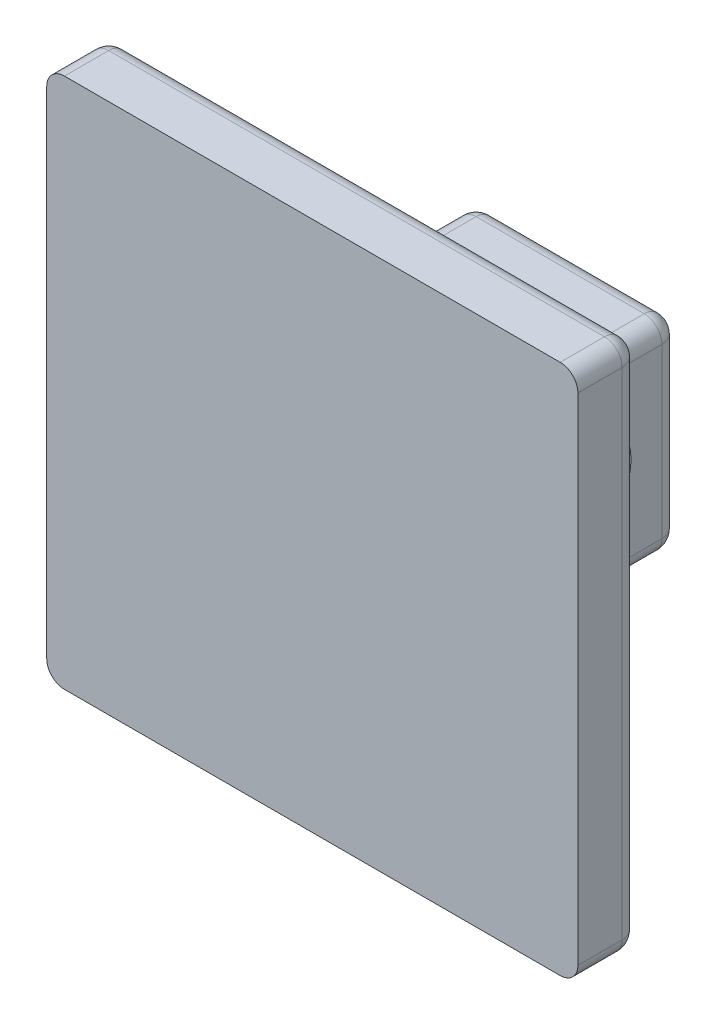
ISO-10303-21;
HEADER;
FILE_DESCRIPTION(('STEP AP214'),'2;1');
FILE_NAME('part.step','',(''),(''),'','','');
FILE_SCHEMA(('AUTOMOTIVE_DESIGN { 1 0 10303 214 1 1 1 1 }'));
ENDSEC;
DATA;
#1=APPLICATION_CONTEXT('core data for automotive mechanical design processes');
#2=APPLICATION_PROTOCOL_DEFINITION('international standard','automotive_design',2000,#1);
#3=PRODUCT_CONTEXT('',#1,'mechanical');
#4=PRODUCT('Part','Part','',(#3));
#5=PRODUCT_RELATED_PRODUCT_CATEGORY('part','',(#4));
#6=PRODUCT_DEFINITION_FORMATION('','',#4);
#7=PRODUCT_DEFINITION_CONTEXT('part definition',#1,'design');
#8=PRODUCT_DEFINITION('design','',#6,#7);
#9=PRODUCT_DEFINITION_SHAPE('','',#8);
#10=(LENGTH_UNIT() NAMED_UNIT(*) SI_UNIT(.MILLI.,.METRE.));
#11=(NAMED_UNIT(*) PLANE_ANGLE_UNIT() SI_UNIT($,.RADIAN.));
#12=(NAMED_UNIT(*) SI_UNIT($,.STERADIAN.) SOLID_ANGLE_UNIT());
#13=UNCERTAINTY_MEASURE_WITH_UNIT(LENGTH_MEASURE(1.E-05),#10,'distance_accuracy_value','');
#14=(GEOMETRIC_REPRESENTATION_CONTEXT(3) GLOBAL_UNCERTAINTY_ASSIGNED_CONTEXT((#13)) GLOBAL_UNIT_ASSIGNED_CONTEXT((#10,
#11,#12)) REPRESENTATION_CONTEXT('',''));
#15=CARTESIAN_POINT('',(0.,0.,0.));
#16=DIRECTION('',(0.,0.,1.));
#17=DIRECTION('',(1.,0.,0.));
#18=AXIS2_PLACEMENT_3D('',#15,#16,#17);
#19=CARTESIAN_POINT('',(-30.,-30.,30.));
#20=DIRECTION('',(1.,0.,0.));
#21=DIRECTION('',(0.,0.,-1.));
#22=AXIS2_PLACEMENT_3D('',#19,#20,#21);
#23=PLANE('',#22);
#24=DIRECTION('',(0.,-1.,0.));
#25=VECTOR('',#24,1.);
#26=CARTESIAN_POINT('',(-30.,-30.,30.));
#27=LINE('',#26,#25);
#28=CARTESIAN_POINT('',(-30.,28.,30.));
#29=VERTEX_POINT('',#28);
#30=CARTESIAN_POINT('',(-30.,-28.,30.));
#31=VERTEX_POINT('',#30);
#32=EDGE_CURVE('E195',#29,#31,#27,.T.);
#33=ORIENTED_EDGE('',*,*,#32,.F.);
#34=DIRECTION('',(0.,0.,-1.));
#35=VECTOR('',#34,1.);
#36=CARTESIAN_POINT('',(-30.,28.,30.));
#37=LINE('',#36,#35);
#38=CARTESIAN_POINT('',(-30.,28.,25.));
#39=VERTEX_POINT('',#38);
#40=EDGE_CURVE('E12',#29,#39,#37,.T.);
#41=ORIENTED_EDGE('',*,*,#40,.T.);
#42=DIRECTION('',(0.,-1.,0.));
#43=VECTOR('',#42,1.);
#44=CARTESIAN_POINT('',(-30.,-30.,25.));
#45=LINE('',#44,#43);
#46=CARTESIAN_POINT('',(-30.,-28.,25.));
#47=VERTEX_POINT('',#46);
#48=EDGE_CURVE('E137',#39,#47,#45,.T.);
#49=ORIENTED_EDGE('',*,*,#48,.T.);
#50=DIRECTION('',(0.,0.,-1.));
#51=VECTOR('',#50,1.);
#52=CARTESIAN_POINT('',(-30.,-28.,30.));
#53=LINE('',#52,#51);
#54=EDGE_CURVE('E60',#47,#31,#53,.F.);
#55=ORIENTED_EDGE('',*,*,#54,.T.);
#56=EDGE_LOOP('',(#33,#41,#49,#55));
#57=FACE_BOUND('',#56,.T.);
#58=ADVANCED_FACE('F51',(#57),#23,.F.);
#59=CARTESIAN_POINT('',(30.,-30.,30.));
#60=DIRECTION('',(0.,1.,0.));
#61=DIRECTION('',(-1.,0.,0.));
#62=AXIS2_PLACEMENT_3D('',#59,#60,#61);
#63=PLANE('',#62);
#64=DIRECTION('',(1.,0.,0.));
#65=VECTOR('',#64,1.);
#66=CARTESIAN_POINT('',(30.,-30.,25.));
#67=LINE('',#66,#65);
#68=CARTESIAN_POINT('',(-28.,-30.,25.));
#69=VERTEX_POINT('',#68);
#70=CARTESIAN_POINT('',(28.,-30.,25.));
#71=VERTEX_POINT('',#70);
#72=EDGE_CURVE('E228',#69,#71,#67,.T.);
#73=ORIENTED_EDGE('',*,*,#72,.T.);
#74=DIRECTION('',(0.,0.,-1.));
#75=VECTOR('',#74,1.);
#76=CARTESIAN_POINT('',(28.,-30.,30.));
#77=LINE('',#76,#75);
#78=CARTESIAN_POINT('',(28.,-30.,30.));
#79=VERTEX_POINT('',#78);
#80=EDGE_CURVE('E179',#71,#79,#77,.F.);
#81=ORIENTED_EDGE('',*,*,#80,.T.);
#82=DIRECTION('',(1.,0.,0.));
#83=VECTOR('',#82,1.);
#84=CARTESIAN_POINT('',(30.,-30.,30.));
#85=LINE('',#84,#83);
#86=CARTESIAN_POINT('',(-28.,-30.,30.));
#87=VERTEX_POINT('',#86);
#88=EDGE_CURVE('E215',#87,#79,#85,.T.);
#89=ORIENTED_EDGE('',*,*,#88,.F.);
#90=DIRECTION('',(0.,0.,-1.));
#91=VECTOR('',#90,1.);
#92=CARTESIAN_POINT('',(-28.,-30.,30.));
#93=LINE('',#92,#91);
#94=EDGE_CURVE('E177',#87,#69,#93,.T.);
#95=ORIENTED_EDGE('',*,*,#94,.T.);
#96=EDGE_LOOP('',(#73,#81,#89,#95));
#97=FACE_BOUND('',#96,.T.);
#98=ADVANCED_FACE('F244',(#97),#63,.F.);
#99=CARTESIAN_POINT('',(30.,-30.,30.));
#100=DIRECTION('',(-1.,0.,0.));
#101=DIRECTION('',(0.,0.,1.));
#102=AXIS2_PLACEMENT_3D('',#99,#100,#101);
#103=PLANE('',#102);
#104=DIRECTION('',(0.,1.,0.));
#105=VECTOR('',#104,1.);
#106=CARTESIAN_POINT('',(30.,-30.,30.));
#107=LINE('',#106,#105);
#108=CARTESIAN_POINT('',(30.,-28.,30.));
#109=VERTEX_POINT('',#108);
#110=CARTESIAN_POINT('',(30.,28.,30.));
#111=VERTEX_POINT('',#110);
#112=EDGE_CURVE('E217',#109,#111,#107,.T.);
#113=ORIENTED_EDGE('',*,*,#112,.F.);
#114=DIRECTION('',(0.,0.,-1.));
#115=VECTOR('',#114,1.);
#116=CARTESIAN_POINT('',(30.,-28.,30.));
#117=LINE('',#116,#115);
#118=CARTESIAN_POINT('',(30.,-28.,25.));
#119=VERTEX_POINT('',#118);
#120=EDGE_CURVE('E175',#109,#119,#117,.T.);
#121=ORIENTED_EDGE('',*,*,#120,.T.);
#122=DIRECTION('',(0.,1.,0.));
#123=VECTOR('',#122,1.);
#124=CARTESIAN_POINT('',(30.,-30.,25.));
#125=LINE('',#124,#123);
#126=CARTESIAN_POINT('',(30.,28.,25.));
#127=VERTEX_POINT('',#126);
#128=EDGE_CURVE('E162',#119,#127,#125,.T.);
#129=ORIENTED_EDGE('',*,*,#128,.T.);
#130=DIRECTION('',(0.,0.,-1.));
#131=VECTOR('',#130,1.);
#132=CARTESIAN_POINT('',(30.,28.,30.));
#133=LINE('',#132,#131);
#134=EDGE_CURVE('E141',#127,#111,#133,.F.);
#135=ORIENTED_EDGE('',*,*,#134,.T.);
#136=EDGE_LOOP('',(#113,#121,#129,#135));
#137=FACE_BOUND('',#136,.T.);
#138=ADVANCED_FACE('F259',(#137),#103,.F.);
#139=CARTESIAN_POINT('',(30.,30.,30.));
#140=DIRECTION('',(0.,-1.,0.));
#141=DIRECTION('',(1.,0.,0.));
#142=AXIS2_PLACEMENT_3D('',#139,#140,#141);
#143=PLANE('',#142);
#144=DIRECTION('',(-1.,0.,0.));
#145=VECTOR('',#144,1.);
#146=CARTESIAN_POINT('',(30.,30.,30.));
#147=LINE('',#146,#145);
#148=CARTESIAN_POINT('',(28.,30.,30.));
#149=VERTEX_POINT('',#148);
#150=CARTESIAN_POINT('',(-28.,30.,30.));
#151=VERTEX_POINT('',#150);
#152=EDGE_CURVE('E221',#149,#151,#147,.T.);
#153=ORIENTED_EDGE('',*,*,#152,.F.);
#154=DIRECTION('',(0.,0.,-1.));
#155=VECTOR('',#154,1.);
#156=CARTESIAN_POINT('',(28.,30.,30.));
#157=LINE('',#156,#155);
#158=CARTESIAN_POINT('',(28.,30.,25.));
#159=VERTEX_POINT('',#158);
#160=EDGE_CURVE('E189',#149,#159,#157,.T.);
#161=ORIENTED_EDGE('',*,*,#160,.T.);
#162=DIRECTION('',(-1.,0.,0.));
#163=VECTOR('',#162,1.);
#164=CARTESIAN_POINT('',(30.,30.,25.));
#165=LINE('',#164,#163);
#166=CARTESIAN_POINT('',(-28.,30.,25.));
#167=VERTEX_POINT('',#166);
#168=EDGE_CURVE('E232',#159,#167,#165,.T.);
#169=ORIENTED_EDGE('',*,*,#168,.T.);
#170=DIRECTION('',(0.,0.,-1.));
#171=VECTOR('',#170,1.);
#172=CARTESIAN_POINT('',(-28.,30.,30.));
#173=LINE('',#172,#171);
#174=EDGE_CURVE('E68',#167,#151,#173,.F.);
#175=ORIENTED_EDGE('',*,*,#174,.T.);
#176=EDGE_LOOP('',(#153,#161,#169,#175));
#177=FACE_BOUND('',#176,.T.);
#178=ADVANCED_FACE('F265',(#177),#143,.F.);
#179=CARTESIAN_POINT('',(0.,0.,30.));
#180=DIRECTION('',(0.,0.,1.));
#181=DIRECTION('',(1.,0.,0.));
#182=AXIS2_PLACEMENT_3D('',#179,#180,#181);
#183=PLANE('',#182);
#184=ORIENTED_EDGE('',*,*,#88,.T.);
#185=CARTESIAN_POINT('',(28.,-28.,30.));
#186=DIRECTION('',(0.,0.,1.));
#187=DIRECTION('',(1.,0.,0.));
#188=AXIS2_PLACEMENT_3D('',#185,#186,#187);
#189=CIRCLE('',#188,2.);
#190=EDGE_CURVE('E186',#79,#109,#189,.T.);
#191=ORIENTED_EDGE('',*,*,#190,.T.);
#192=ORIENTED_EDGE('',*,*,#112,.T.);
#193=CARTESIAN_POINT('',(28.,28.,30.));
#194=DIRECTION('',(0.,0.,1.));
#195=DIRECTION('',(1.,0.,0.));
#196=AXIS2_PLACEMENT_3D('',#193,#194,#195);
#197=CIRCLE('',#196,2.);
#198=EDGE_CURVE('E75',#111,#149,#197,.T.);
#199=ORIENTED_EDGE('',*,*,#198,.T.);
#200=ORIENTED_EDGE('',*,*,#152,.T.);
#201=CARTESIAN_POINT('',(-28.,28.,30.));
#202=DIRECTION('',(0.,0.,1.));
#203=DIRECTION('',(1.,0.,0.));
#204=AXIS2_PLACEMENT_3D('',#201,#202,#203);
#205=CIRCLE('',#204,2.);
#206=EDGE_CURVE('E183',#151,#29,#205,.T.);
#207=ORIENTED_EDGE('',*,*,#206,.T.);
#208=ORIENTED_EDGE('',*,*,#32,.T.);
#209=CARTESIAN_POINT('',(-28.,-28.,30.));
#210=DIRECTION('',(0.,0.,1.));
#211=DIRECTION('',(1.,0.,0.));
#212=AXIS2_PLACEMENT_3D('',#209,#210,#211);
#213=CIRCLE('',#212,2.);
#214=EDGE_CURVE('E181',#31,#87,#213,.T.);
#215=ORIENTED_EDGE('',*,*,#214,.T.);
#216=EDGE_LOOP('',(#184,#191,#192,#199,#200,#207,#208,#215));
#217=FACE_BOUND('',#216,.T.);
#218=ADVANCED_FACE('F212',(#217),#183,.T.);
#219=CARTESIAN_POINT('',(0.,0.,23.));
#220=DIRECTION('',(0.,0.,1.));
#221=DIRECTION('',(1.,0.,0.));
#222=AXIS2_PLACEMENT_3D('',#219,#220,#221);
#223=PLANE('',#222);
#224=DIRECTION('',(-1.,0.,0.));
#225=VECTOR('',#224,1.);
#226=CARTESIAN_POINT('',(0.,28.,23.));
#227=LINE('',#226,#225);
#228=CARTESIAN_POINT('',(-28.,28.,23.));
#229=VERTEX_POINT('',#228);
#230=CARTESIAN_POINT('',(28.,28.,23.));
#231=VERTEX_POINT('',#230);
#232=EDGE_CURVE('E150',#229,#231,#227,.F.);
#233=ORIENTED_EDGE('',*,*,#232,.T.);
#234=DIRECTION('',(0.,1.,0.));
#235=VECTOR('',#234,1.);
#236=CARTESIAN_POINT('',(28.,0.,23.));
#237=LINE('',#236,#235);
#238=CARTESIAN_POINT('',(28.,-28.,23.));
#239=VERTEX_POINT('',#238);
#240=EDGE_CURVE('E226',#231,#239,#237,.F.);
#241=ORIENTED_EDGE('',*,*,#240,.T.);
#242=DIRECTION('',(1.,0.,0.));
#243=VECTOR('',#242,1.);
#244=CARTESIAN_POINT('',(0.,-28.,23.));
#245=LINE('',#244,#243);
#246=CARTESIAN_POINT('',(-28.,-28.,23.));
#247=VERTEX_POINT('',#246);
#248=EDGE_CURVE('E153',#239,#247,#245,.F.);
#249=ORIENTED_EDGE('',*,*,#248,.T.);
#250=DIRECTION('',(0.,-1.,0.));
#251=VECTOR('',#250,1.);
#252=CARTESIAN_POINT('',(-28.,0.,23.));
#253=LINE('',#252,#251);
#254=EDGE_CURVE('E135',#247,#229,#253,.F.);
#255=ORIENTED_EDGE('',*,*,#254,.T.);
#256=EDGE_LOOP('',(#233,#241,#249,#255));
#257=FACE_BOUND('',#256,.T.);
#258=ADVANCED_FACE('F148',(#257),#223,.F.);
#259=CARTESIAN_POINT('',(-28.,-30.,25.));
#260=DIRECTION('',(0.,-1.,0.));
#261=DIRECTION('',(0.,0.,-1.));
#262=AXIS2_PLACEMENT_3D('',#259,#260,#261);
#263=CYLINDRICAL_SURFACE('',#262,2.);
#264=ORIENTED_EDGE('',*,*,#48,.F.);
#265=CARTESIAN_POINT('',(-28.,28.,25.));
#266=DIRECTION('',(0.,-1.,0.));
#267=DIRECTION('',(0.,0.,-1.));
#268=AXIS2_PLACEMENT_3D('',#265,#266,#267);
#269=CIRCLE('',#268,2.);
#270=EDGE_CURVE('E132',#39,#229,#269,.T.);
#271=ORIENTED_EDGE('',*,*,#270,.T.);
#272=ORIENTED_EDGE('',*,*,#254,.F.);
#273=CARTESIAN_POINT('',(-28.,-28.,25.));
#274=DIRECTION('',(0.,-1.,0.));
#275=DIRECTION('',(0.,0.,-1.));
#276=AXIS2_PLACEMENT_3D('',#273,#274,#275);
#277=CIRCLE('',#276,2.);
#278=EDGE_CURVE('E142',#247,#47,#277,.F.);
#279=ORIENTED_EDGE('',*,*,#278,.T.);
#280=EDGE_LOOP('',(#264,#271,#272,#279));
#281=FACE_BOUND('',#280,.T.);
#282=ADVANCED_FACE('F134',(#281),#263,.T.);
#283=CARTESIAN_POINT('',(30.,-28.,25.));
#284=DIRECTION('',(1.,0.,0.));
#285=DIRECTION('',(0.,1.,0.));
#286=AXIS2_PLACEMENT_3D('',#283,#284,#285);
#287=CYLINDRICAL_SURFACE('',#286,2.);
#288=ORIENTED_EDGE('',*,*,#248,.F.);
#289=CARTESIAN_POINT('',(28.,-28.,25.));
#290=DIRECTION('',(1.,0.,0.));
#291=DIRECTION('',(0.,1.,0.));
#292=AXIS2_PLACEMENT_3D('',#289,#290,#291);
#293=CIRCLE('',#292,2.);
#294=EDGE_CURVE('E166',#239,#71,#293,.F.);
#295=ORIENTED_EDGE('',*,*,#294,.T.);
#296=ORIENTED_EDGE('',*,*,#72,.F.);
#297=CARTESIAN_POINT('',(-28.,-28.,25.));
#298=DIRECTION('',(1.,0.,0.));
#299=DIRECTION('',(0.,1.,0.));
#300=AXIS2_PLACEMENT_3D('',#297,#298,#299);
#301=CIRCLE('',#300,2.);
#302=EDGE_CURVE('E169',#69,#247,#301,.T.);
#303=ORIENTED_EDGE('',*,*,#302,.T.);
#304=EDGE_LOOP('',(#288,#295,#296,#303));
#305=FACE_BOUND('',#304,.T.);
#306=ADVANCED_FACE('F241',(#305),#287,.T.);
#307=CARTESIAN_POINT('',(30.,28.,25.));
#308=DIRECTION('',(-1.,0.,0.));
#309=DIRECTION('',(0.,-1.,0.));
#310=AXIS2_PLACEMENT_3D('',#307,#308,#309);
#311=CYLINDRICAL_SURFACE('',#310,2.);
#312=ORIENTED_EDGE('',*,*,#168,.F.);
#313=CARTESIAN_POINT('',(28.,28.,25.));
#314=DIRECTION('',(-1.,0.,0.));
#315=DIRECTION('',(0.,-1.,0.));
#316=AXIS2_PLACEMENT_3D('',#313,#314,#315);
#317=CIRCLE('',#316,2.);
#318=EDGE_CURVE('E161',#159,#231,#317,.T.);
#319=ORIENTED_EDGE('',*,*,#318,.T.);
#320=ORIENTED_EDGE('',*,*,#232,.F.);
#321=CARTESIAN_POINT('',(-28.,28.,25.));
#322=DIRECTION('',(-1.,0.,0.));
#323=DIRECTION('',(0.,-1.,0.));
#324=AXIS2_PLACEMENT_3D('',#321,#322,#323);
#325=CIRCLE('',#324,2.);
#326=EDGE_CURVE('E159',#229,#167,#325,.F.);
#327=ORIENTED_EDGE('',*,*,#326,.T.);
#328=EDGE_LOOP('',(#312,#319,#320,#327));
#329=FACE_BOUND('',#328,.T.);
#330=ADVANCED_FACE('F158',(#329),#311,.T.);
#331=CARTESIAN_POINT('',(28.,-30.,25.));
#332=DIRECTION('',(0.,1.,0.));
#333=DIRECTION('',(0.,0.,1.));
#334=AXIS2_PLACEMENT_3D('',#331,#332,#333);
#335=CYLINDRICAL_SURFACE('',#334,2.);
#336=ORIENTED_EDGE('',*,*,#128,.F.);
#337=CARTESIAN_POINT('',(28.,-28.,25.));
#338=DIRECTION('',(0.,1.,0.));
#339=DIRECTION('',(0.,0.,1.));
#340=AXIS2_PLACEMENT_3D('',#337,#338,#339);
#341=CIRCLE('',#340,2.);
#342=EDGE_CURVE('E237',#119,#239,#341,.T.);
#343=ORIENTED_EDGE('',*,*,#342,.T.);
#344=ORIENTED_EDGE('',*,*,#240,.F.);
#345=CARTESIAN_POINT('',(28.,28.,25.));
#346=DIRECTION('',(0.,1.,0.));
#347=DIRECTION('',(0.,0.,1.));
#348=AXIS2_PLACEMENT_3D('',#345,#346,#347);
#349=CIRCLE('',#348,2.);
#350=EDGE_CURVE('E234',#231,#127,#349,.F.);
#351=ORIENTED_EDGE('',*,*,#350,.T.);
#352=EDGE_LOOP('',(#336,#343,#344,#351));
#353=FACE_BOUND('',#352,.T.);
#354=ADVANCED_FACE('F255',(#353),#335,.T.);
#355=CARTESIAN_POINT('',(28.,-28.,30.));
#356=DIRECTION('',(0.,0.,-1.));
#357=DIRECTION('',(-1.,0.,0.));
#358=AXIS2_PLACEMENT_3D('',#355,#356,#357);
#359=CYLINDRICAL_SURFACE('',#358,2.);
#360=ORIENTED_EDGE('',*,*,#190,.F.);
#361=ORIENTED_EDGE('',*,*,#80,.F.);
#362=CARTESIAN_POINT('',(28.,-28.,25.));
#363=DIRECTION('',(0.,0.,-1.));
#364=DIRECTION('',(-1.,0.,0.));
#365=AXIS2_PLACEMENT_3D('',#362,#363,#364);
#366=CIRCLE('',#365,2.);
#367=EDGE_CURVE('E192',#119,#71,#366,.T.);
#368=ORIENTED_EDGE('',*,*,#367,.F.);
#369=ORIENTED_EDGE('',*,*,#120,.F.);
#370=EDGE_LOOP('',(#360,#361,#368,#369));
#371=FACE_BOUND('',#370,.T.);
#372=ADVANCED_FACE('F248',(#371),#359,.T.);
#373=CARTESIAN_POINT('',(28.,-28.,25.));
#374=DIRECTION('',(0.,0.,1.));
#375=DIRECTION('',(1.,0.,0.));
#376=AXIS2_PLACEMENT_3D('',#373,#374,#375);
#377=SPHERICAL_SURFACE('',#376,2.);
#378=ORIENTED_EDGE('',*,*,#367,.T.);
#379=ORIENTED_EDGE('',*,*,#294,.F.);
#380=ORIENTED_EDGE('',*,*,#342,.F.);
#381=EDGE_LOOP('',(#378,#379,#380));
#382=FACE_BOUND('',#381,.T.);
#383=ADVANCED_FACE('F252',(#382),#377,.T.);
#384=CARTESIAN_POINT('',(28.,28.,30.));
#385=DIRECTION('',(0.,0.,-1.));
#386=DIRECTION('',(-1.,0.,0.));
#387=AXIS2_PLACEMENT_3D('',#384,#385,#386);
#388=CYLINDRICAL_SURFACE('',#387,2.);
#389=ORIENTED_EDGE('',*,*,#198,.F.);
#390=ORIENTED_EDGE('',*,*,#134,.F.);
#391=CARTESIAN_POINT('',(28.,28.,25.));
#392=DIRECTION('',(0.,0.,-1.));
#393=DIRECTION('',(-1.,0.,0.));
#394=AXIS2_PLACEMENT_3D('',#391,#392,#393);
#395=CIRCLE('',#394,2.);
#396=EDGE_CURVE('E196',#159,#127,#395,.T.);
#397=ORIENTED_EDGE('',*,*,#396,.F.);
#398=ORIENTED_EDGE('',*,*,#160,.F.);
#399=EDGE_LOOP('',(#389,#390,#397,#398));
#400=FACE_BOUND('',#399,.T.);
#401=ADVANCED_FACE('F263',(#400),#388,.T.);
#402=CARTESIAN_POINT('',(28.,28.,25.));
#403=DIRECTION('',(0.,0.,1.));
#404=DIRECTION('',(1.,0.,0.));
#405=AXIS2_PLACEMENT_3D('',#402,#403,#404);
#406=SPHERICAL_SURFACE('',#405,2.);
#407=ORIENTED_EDGE('',*,*,#350,.F.);
#408=ORIENTED_EDGE('',*,*,#318,.F.);
#409=ORIENTED_EDGE('',*,*,#396,.T.);
#410=EDGE_LOOP('',(#407,#408,#409));
#411=FACE_BOUND('',#410,.T.);
#412=ADVANCED_FACE('F267',(#411),#406,.T.);
#413=CARTESIAN_POINT('',(-28.,28.,30.));
#414=DIRECTION('',(0.,0.,-1.));
#415=DIRECTION('',(-1.,0.,0.));
#416=AXIS2_PLACEMENT_3D('',#413,#414,#415);
#417=CYLINDRICAL_SURFACE('',#416,2.);
#418=ORIENTED_EDGE('',*,*,#206,.F.);
#419=ORIENTED_EDGE('',*,*,#174,.F.);
#420=CARTESIAN_POINT('',(-28.,28.,25.));
#421=DIRECTION('',(0.,0.,-1.));
#422=DIRECTION('',(-1.,0.,0.));
#423=AXIS2_PLACEMENT_3D('',#420,#421,#422);
#424=CIRCLE('',#423,2.);
#425=EDGE_CURVE('E165',#39,#167,#424,.T.);
#426=ORIENTED_EDGE('',*,*,#425,.F.);
#427=ORIENTED_EDGE('',*,*,#40,.F.);
#428=EDGE_LOOP('',(#418,#419,#426,#427));
#429=FACE_BOUND('',#428,.T.);
#430=ADVANCED_FACE('F269',(#429),#417,.T.);
#431=CARTESIAN_POINT('',(-28.,28.,25.));
#432=DIRECTION('',(0.,0.,1.));
#433=DIRECTION('',(1.,0.,0.));
#434=AXIS2_PLACEMENT_3D('',#431,#432,#433);
#435=SPHERICAL_SURFACE('',#434,2.);
#436=ORIENTED_EDGE('',*,*,#326,.F.);
#437=ORIENTED_EDGE('',*,*,#270,.F.);
#438=ORIENTED_EDGE('',*,*,#425,.T.);
#439=EDGE_LOOP('',(#436,#437,#438));
#440=FACE_BOUND('',#439,.T.);
#441=ADVANCED_FACE('F164',(#440),#435,.T.);
#442=CARTESIAN_POINT('',(-28.,-28.,30.));
#443=DIRECTION('',(0.,0.,-1.));
#444=DIRECTION('',(-1.,0.,0.));
#445=AXIS2_PLACEMENT_3D('',#442,#443,#444);
#446=CYLINDRICAL_SURFACE('',#445,2.);
#447=ORIENTED_EDGE('',*,*,#214,.F.);
#448=ORIENTED_EDGE('',*,*,#54,.F.);
#449=CARTESIAN_POINT('',(-28.,-28.,25.));
#450=DIRECTION('',(0.,0.,-1.));
#451=DIRECTION('',(-1.,0.,0.));
#452=AXIS2_PLACEMENT_3D('',#449,#450,#451);
#453=CIRCLE('',#452,2.);
#454=EDGE_CURVE('E55',#69,#47,#453,.T.);
#455=ORIENTED_EDGE('',*,*,#454,.F.);
#456=ORIENTED_EDGE('',*,*,#94,.F.);
#457=EDGE_LOOP('',(#447,#448,#455,#456));
#458=FACE_BOUND('',#457,.T.);
#459=ADVANCED_FACE('F53',(#458),#446,.T.);
#460=CARTESIAN_POINT('',(-28.,-28.,25.));
#461=DIRECTION('',(0.,0.,1.));
#462=DIRECTION('',(1.,0.,0.));
#463=AXIS2_PLACEMENT_3D('',#460,#461,#462);
#464=SPHERICAL_SURFACE('',#463,2.);
#465=ORIENTED_EDGE('',*,*,#454,.T.);
#466=ORIENTED_EDGE('',*,*,#278,.F.);
#467=ORIENTED_EDGE('',*,*,#302,.F.);
#468=EDGE_LOOP('',(#465,#466,#467));
#469=FACE_BOUND('',#468,.T.);
#470=ADVANCED_FACE('F201',(#469),#464,.T.);
#471=CLOSED_SHELL('',(#58,#98,#138,#178,#218,#258,#282,#306,#330,#354,#372,#383,#401,#412,#430,
#441,#459,#470));
#472=MANIFOLD_SOLID_BREP('B2',#471);
#473=CARTESIAN_POINT('',(11.5,-11.5,23.));
#474=DIRECTION('',(-1.,0.,0.));
#475=DIRECTION('',(0.,0.,1.));
#476=AXIS2_PLACEMENT_3D('',#473,#474,#475);
#477=PLANE('',#476);
#478=CARTESIAN_POINT('',(11.5,0.,11.5));
#479=DIRECTION('',(1.,0.,0.));
#480=DIRECTION('',(0.,0.,-1.));
#481=AXIS2_PLACEMENT_3D('',#478,#479,#480);
#482=CIRCLE('',#481,6.);
#483=CARTESIAN_POINT('',(11.5,0.,5.5));
#484=VERTEX_POINT('',#483);
#485=EDGE_CURVE('E627',#484,#484,#482,.T.);
#486=ORIENTED_EDGE('',*,*,#485,.F.);
#487=EDGE_LOOP('',(#486));
#488=FACE_BOUND('',#487,.T.);
#489=DIRECTION('',(0.,1.,0.));
#490=VECTOR('',#489,1.);
#491=CARTESIAN_POINT('',(11.5,-11.5,23.));
#492=LINE('',#491,#490);
#493=CARTESIAN_POINT('',(11.5,-9.5,23.));
#494=VERTEX_POINT('',#493);
#495=CARTESIAN_POINT('',(11.5,9.5,23.));
#496=VERTEX_POINT('',#495);
#497=EDGE_CURVE('E635',#494,#496,#492,.T.);
#498=ORIENTED_EDGE('',*,*,#497,.F.);
#499=DIRECTION('',(0.,0.,-1.));
#500=VECTOR('',#499,1.);
#501=CARTESIAN_POINT('',(11.5,-9.5,23.));
#502=LINE('',#501,#500);
#503=CARTESIAN_POINT('',(11.5,-9.5,2.));
#504=VERTEX_POINT('',#503);
#505=EDGE_CURVE('E588',#494,#504,#502,.T.);
#506=ORIENTED_EDGE('',*,*,#505,.T.);
#507=DIRECTION('',(0.,1.,0.));
#508=VECTOR('',#507,1.);
#509=CARTESIAN_POINT('',(11.5,11.5,2.));
#510=LINE('',#509,#508);
#511=CARTESIAN_POINT('',(11.5,9.5,2.));
#512=VERTEX_POINT('',#511);
#513=EDGE_CURVE('E586',#504,#512,#510,.T.);
#514=ORIENTED_EDGE('',*,*,#513,.T.);
#515=DIRECTION('',(0.,0.,-1.));
#516=VECTOR('',#515,1.);
#517=CARTESIAN_POINT('',(11.5,9.5,23.));
#518=LINE('',#517,#516);
#519=EDGE_CURVE('E584',#512,#496,#518,.F.);
#520=ORIENTED_EDGE('',*,*,#519,.T.);
#521=EDGE_LOOP('',(#498,#506,#514,#520));
#522=FACE_BOUND('',#521,.T.);
#523=ADVANCED_FACE('F459',(#488,#522),#477,.F.);
#524=CARTESIAN_POINT('',(-11.5,11.5,23.));
#525=DIRECTION('',(0.,-1.,0.));
#526=DIRECTION('',(0.,0.,-1.));
#527=AXIS2_PLACEMENT_3D('',#524,#525,#526);
#528=PLANE('',#527);
#529=DIRECTION('',(-1.,0.,0.));
#530=VECTOR('',#529,1.);
#531=CARTESIAN_POINT('',(-11.5,11.5,2.));
#532=LINE('',#531,#530);
#533=CARTESIAN_POINT('',(9.5,11.5,2.));
#534=VERTEX_POINT('',#533);
#535=CARTESIAN_POINT('',(-9.5,11.5,2.));
#536=VERTEX_POINT('',#535);
#537=EDGE_CURVE('E580',#534,#536,#532,.T.);
#538=ORIENTED_EDGE('',*,*,#537,.T.);
#539=DIRECTION('',(0.,0.,-1.));
#540=VECTOR('',#539,1.);
#541=CARTESIAN_POINT('',(-9.5,11.5,23.));
#542=LINE('',#541,#540);
#543=CARTESIAN_POINT('',(-9.5,11.5,23.));
#544=VERTEX_POINT('',#543);
#545=EDGE_CURVE('E582',#536,#544,#542,.F.);
#546=ORIENTED_EDGE('',*,*,#545,.T.);
#547=DIRECTION('',(-1.,0.,0.));
#548=VECTOR('',#547,1.);
#549=CARTESIAN_POINT('',(-11.5,11.5,23.));
#550=LINE('',#549,#548);
#551=CARTESIAN_POINT('',(9.5,11.5,23.));
#552=VERTEX_POINT('',#551);
#553=EDGE_CURVE('E544',#552,#544,#550,.T.);
#554=ORIENTED_EDGE('',*,*,#553,.F.);
#555=DIRECTION('',(0.,0.,-1.));
#556=VECTOR('',#555,1.);
#557=CARTESIAN_POINT('',(9.5,11.5,23.));
#558=LINE('',#557,#556);
#559=EDGE_CURVE('E578',#552,#534,#558,.T.);
#560=ORIENTED_EDGE('',*,*,#559,.T.);
#561=EDGE_LOOP('',(#538,#546,#554,#560));
#562=FACE_BOUND('',#561,.T.);
#563=ADVANCED_FACE('F649',(#562),#528,.F.);
#564=CARTESIAN_POINT('',(-11.5,-11.5,23.));
#565=DIRECTION('',(1.,0.,0.));
#566=DIRECTION('',(0.,0.,-1.));
#567=AXIS2_PLACEMENT_3D('',#564,#565,#566);
#568=PLANE('',#567);
#569=CARTESIAN_POINT('',(-11.5,0.,11.5));
#570=DIRECTION('',(1.,0.,0.));
#571=DIRECTION('',(0.,0.,-1.));
#572=AXIS2_PLACEMENT_3D('',#569,#570,#571);
#573=CIRCLE('',#572,6.);
#574=CARTESIAN_POINT('',(-11.5,0.,5.5));
#575=VERTEX_POINT('',#574);
#576=EDGE_CURVE('E630',#575,#575,#573,.F.);
#577=ORIENTED_EDGE('',*,*,#576,.F.);
#578=EDGE_LOOP('',(#577));
#579=FACE_BOUND('',#578,.T.);
#580=DIRECTION('',(0.,-1.,0.));
#581=VECTOR('',#580,1.);
#582=CARTESIAN_POINT('',(-11.5,-11.5,2.));
#583=LINE('',#582,#581);
#584=CARTESIAN_POINT('',(-11.5,9.5,2.));
#585=VERTEX_POINT('',#584);
#586=CARTESIAN_POINT('',(-11.5,-9.5,2.));
#587=VERTEX_POINT('',#586);
#588=EDGE_CURVE('E563',#585,#587,#583,.T.);
#589=ORIENTED_EDGE('',*,*,#588,.T.);
#590=DIRECTION('',(0.,0.,-1.));
#591=VECTOR('',#590,1.);
#592=CARTESIAN_POINT('',(-11.5,-9.5,23.));
#593=LINE('',#592,#591);
#594=CARTESIAN_POINT('',(-11.5,-9.5,23.));
#595=VERTEX_POINT('',#594);
#596=EDGE_CURVE('E556',#587,#595,#593,.F.);
#597=ORIENTED_EDGE('',*,*,#596,.T.);
#598=DIRECTION('',(0.,-1.,0.));
#599=VECTOR('',#598,1.);
#600=CARTESIAN_POINT('',(-11.5,-11.5,23.));
#601=LINE('',#600,#599);
#602=CARTESIAN_POINT('',(-11.5,9.5,23.));
#603=VERTEX_POINT('',#602);
#604=EDGE_CURVE('E541',#603,#595,#601,.T.);
#605=ORIENTED_EDGE('',*,*,#604,.F.);
#606=DIRECTION('',(0.,0.,-1.));
#607=VECTOR('',#606,1.);
#608=CARTESIAN_POINT('',(-11.5,9.5,23.));
#609=LINE('',#608,#607);
#610=EDGE_CURVE('E553',#603,#585,#609,.T.);
#611=ORIENTED_EDGE('',*,*,#610,.T.);
#612=EDGE_LOOP('',(#589,#597,#605,#611));
#613=FACE_BOUND('',#612,.T.);
#614=ADVANCED_FACE('F552',(#579,#613),#568,.F.);
#615=CARTESIAN_POINT('',(-11.5,-11.5,23.));
#616=DIRECTION('',(0.,1.,0.));
#617=DIRECTION('',(0.,0.,1.));
#618=AXIS2_PLACEMENT_3D('',#615,#616,#617);
#619=PLANE('',#618);
#620=DIRECTION('',(1.,0.,0.));
#621=VECTOR('',#620,1.);
#622=CARTESIAN_POINT('',(11.5,-11.5,2.));
#623=LINE('',#622,#621);
#624=CARTESIAN_POINT('',(-9.5,-11.5,2.));
#625=VERTEX_POINT('',#624);
#626=CARTESIAN_POINT('',(9.5,-11.5,2.));
#627=VERTEX_POINT('',#626);
#628=EDGE_CURVE('E476',#625,#627,#623,.T.);
#629=ORIENTED_EDGE('',*,*,#628,.T.);
#630=DIRECTION('',(0.,0.,-1.));
#631=VECTOR('',#630,1.);
#632=CARTESIAN_POINT('',(9.5,-11.5,23.));
#633=LINE('',#632,#631);
#634=CARTESIAN_POINT('',(9.5,-11.5,23.));
#635=VERTEX_POINT('',#634);
#636=EDGE_CURVE('E592',#627,#635,#633,.F.);
#637=ORIENTED_EDGE('',*,*,#636,.T.);
#638=DIRECTION('',(1.,0.,0.));
#639=VECTOR('',#638,1.);
#640=CARTESIAN_POINT('',(-11.5,-11.5,23.));
#641=LINE('',#640,#639);
#642=CARTESIAN_POINT('',(-9.5,-11.5,23.));
#643=VERTEX_POINT('',#642);
#644=EDGE_CURVE('E557',#643,#635,#641,.T.);
#645=ORIENTED_EDGE('',*,*,#644,.F.);
#646=DIRECTION('',(0.,0.,-1.));
#647=VECTOR('',#646,1.);
#648=CARTESIAN_POINT('',(-9.5,-11.5,23.));
#649=LINE('',#648,#647);
#650=EDGE_CURVE('E481',#643,#625,#649,.T.);
#651=ORIENTED_EDGE('',*,*,#650,.T.);
#652=EDGE_LOOP('',(#629,#637,#645,#651));
#653=FACE_BOUND('',#652,.T.);
#654=ADVANCED_FACE('F668',(#653),#619,.F.);
#655=CARTESIAN_POINT('',(0.,0.,23.));
#656=DIRECTION('',(0.,0.,-1.));
#657=DIRECTION('',(-1.,0.,0.));
#658=AXIS2_PLACEMENT_3D('',#655,#656,#657);
#659=PLANE('',#658);
#660=ORIENTED_EDGE('',*,*,#644,.T.);
#661=CARTESIAN_POINT('',(9.5,-9.5,23.));
#662=DIRECTION('',(0.,0.,-1.));
#663=DIRECTION('',(-1.,0.,0.));
#664=AXIS2_PLACEMENT_3D('',#661,#662,#663);
#665=CIRCLE('',#664,2.);
#666=EDGE_CURVE('E49',#635,#494,#665,.F.);
#667=ORIENTED_EDGE('',*,*,#666,.T.);
#668=ORIENTED_EDGE('',*,*,#497,.T.);
#669=CARTESIAN_POINT('',(9.5,9.5,23.));
#670=DIRECTION('',(0.,0.,-1.));
#671=DIRECTION('',(-1.,0.,0.));
#672=AXIS2_PLACEMENT_3D('',#669,#670,#671);
#673=CIRCLE('',#672,2.);
#674=EDGE_CURVE('E548',#496,#552,#673,.F.);
#675=ORIENTED_EDGE('',*,*,#674,.T.);
#676=ORIENTED_EDGE('',*,*,#553,.T.);
#677=CARTESIAN_POINT('',(-9.5,9.5,23.));
#678=DIRECTION('',(0.,0.,-1.));
#679=DIRECTION('',(-1.,0.,0.));
#680=AXIS2_PLACEMENT_3D('',#677,#678,#679);
#681=CIRCLE('',#680,2.);
#682=EDGE_CURVE('E537',#544,#603,#681,.F.);
#683=ORIENTED_EDGE('',*,*,#682,.T.);
#684=ORIENTED_EDGE('',*,*,#604,.T.);
#685=CARTESIAN_POINT('',(-9.5,-9.5,23.));
#686=DIRECTION('',(0.,0.,-1.));
#687=DIRECTION('',(-1.,0.,0.));
#688=AXIS2_PLACEMENT_3D('',#685,#686,#687);
#689=CIRCLE('',#688,2.);
#690=EDGE_CURVE('E468',#595,#643,#689,.F.);
#691=ORIENTED_EDGE('',*,*,#690,.T.);
#692=EDGE_LOOP('',(#660,#667,#668,#675,#676,#683,#684,#691));
#693=FACE_BOUND('',#692,.T.);
#694=ADVANCED_FACE('F540',(#693),#659,.F.);
#695=CARTESIAN_POINT('',(0.,0.,0.));
#696=DIRECTION('',(0.,0.,-1.));
#697=DIRECTION('',(-1.,0.,0.));
#698=AXIS2_PLACEMENT_3D('',#695,#696,#697);
#699=PLANE('',#698);
#700=DIRECTION('',(1.,0.,0.));
#701=VECTOR('',#700,1.);
#702=CARTESIAN_POINT('',(-11.5,-9.5,0.));
#703=LINE('',#702,#701);
#704=CARTESIAN_POINT('',(9.5,-9.5,0.));
#705=VERTEX_POINT('',#704);
#706=CARTESIAN_POINT('',(-9.5,-9.5,0.));
#707=VERTEX_POINT('',#706);
#708=EDGE_CURVE('E569',#705,#707,#703,.F.);
#709=ORIENTED_EDGE('',*,*,#708,.T.);
#710=DIRECTION('',(0.,-1.,0.));
#711=VECTOR('',#710,1.);
#712=CARTESIAN_POINT('',(-9.5,11.5,0.));
#713=LINE('',#712,#711);
#714=CARTESIAN_POINT('',(-9.5,9.5,0.));
#715=VERTEX_POINT('',#714);
#716=EDGE_CURVE('E575',#707,#715,#713,.F.);
#717=ORIENTED_EDGE('',*,*,#716,.T.);
#718=DIRECTION('',(-1.,0.,0.));
#719=VECTOR('',#718,1.);
#720=CARTESIAN_POINT('',(11.5,9.5,0.));
#721=LINE('',#720,#719);
#722=CARTESIAN_POINT('',(9.5,9.5,0.));
#723=VERTEX_POINT('',#722);
#724=EDGE_CURVE('E573',#715,#723,#721,.F.);
#725=ORIENTED_EDGE('',*,*,#724,.T.);
#726=DIRECTION('',(0.,1.,0.));
#727=VECTOR('',#726,1.);
#728=CARTESIAN_POINT('',(9.5,-11.5,0.));
#729=LINE('',#728,#727);
#730=EDGE_CURVE('E571',#723,#705,#729,.F.);
#731=ORIENTED_EDGE('',*,*,#730,.T.);
#732=EDGE_LOOP('',(#709,#717,#725,#731));
#733=FACE_BOUND('',#732,.T.);
#734=ADVANCED_FACE('F680',(#733),#699,.T.);
#735=CARTESIAN_POINT('',(-30.001,0.,11.5));
#736=DIRECTION('',(1.,0.,0.));
#737=DIRECTION('',(0.,0.,-1.));
#738=AXIS2_PLACEMENT_3D('',#735,#736,#737);
#739=CYLINDRICAL_SURFACE('',#738,6.);
#740=ORIENTED_EDGE('',*,*,#485,.T.);
#741=EDGE_LOOP('',(#740));
#742=FACE_BOUND('',#741,.T.);
#743=ORIENTED_EDGE('',*,*,#576,.T.);
#744=EDGE_LOOP('',(#743));
#745=FACE_BOUND('',#744,.T.);
#746=ADVANCED_FACE('F718',(#742,#745),#739,.F.);
#747=CARTESIAN_POINT('',(9.5,9.5,23.));
#748=DIRECTION('',(0.,0.,-1.));
#749=DIRECTION('',(-1.,0.,0.));
#750=AXIS2_PLACEMENT_3D('',#747,#748,#749);
#751=CYLINDRICAL_SURFACE('',#750,2.);
#752=ORIENTED_EDGE('',*,*,#674,.F.);
#753=ORIENTED_EDGE('',*,*,#519,.F.);
#754=CARTESIAN_POINT('',(9.5,9.5,2.));
#755=DIRECTION('',(0.,0.,-1.));
#756=DIRECTION('',(-1.,0.,0.));
#757=AXIS2_PLACEMENT_3D('',#754,#755,#756);
#758=CIRCLE('',#757,2.);
#759=EDGE_CURVE('E621',#534,#512,#758,.T.);
#760=ORIENTED_EDGE('',*,*,#759,.F.);
#761=ORIENTED_EDGE('',*,*,#559,.F.);
#762=EDGE_LOOP('',(#752,#753,#760,#761));
#763=FACE_BOUND('',#762,.T.);
#764=ADVANCED_FACE('F461',(#763),#751,.T.);
#765=CARTESIAN_POINT('',(9.5,-9.5,23.));
#766=DIRECTION('',(0.,0.,-1.));
#767=DIRECTION('',(-1.,0.,0.));
#768=AXIS2_PLACEMENT_3D('',#765,#766,#767);
#769=CYLINDRICAL_SURFACE('',#768,2.);
#770=ORIENTED_EDGE('',*,*,#666,.F.);
#771=ORIENTED_EDGE('',*,*,#636,.F.);
#772=CARTESIAN_POINT('',(9.5,-9.5,2.));
#773=DIRECTION('',(0.,0.,-1.));
#774=DIRECTION('',(-1.,0.,0.));
#775=AXIS2_PLACEMENT_3D('',#772,#773,#774);
#776=CIRCLE('',#775,2.);
#777=EDGE_CURVE('E619',#504,#627,#776,.T.);
#778=ORIENTED_EDGE('',*,*,#777,.F.);
#779=ORIENTED_EDGE('',*,*,#505,.F.);
#780=EDGE_LOOP('',(#770,#771,#778,#779));
#781=FACE_BOUND('',#780,.T.);
#782=ADVANCED_FACE('F671',(#781),#769,.T.);
#783=CARTESIAN_POINT('',(9.5,-11.5,2.));
#784=DIRECTION('',(0.,-1.,0.));
#785=DIRECTION('',(0.,0.,-1.));
#786=AXIS2_PLACEMENT_3D('',#783,#784,#785);
#787=CYLINDRICAL_SURFACE('',#786,2.);
#788=CARTESIAN_POINT('',(9.5,9.5,2.));
#789=DIRECTION('',(0.,1.,0.));
#790=DIRECTION('',(0.,0.,1.));
#791=AXIS2_PLACEMENT_3D('',#788,#789,#790);
#792=CIRCLE('',#791,2.);
#793=EDGE_CURVE('E463',#512,#723,#792,.T.);
#794=ORIENTED_EDGE('',*,*,#793,.F.);
#795=ORIENTED_EDGE('',*,*,#513,.F.);
#796=CARTESIAN_POINT('',(9.5,-9.5,2.));
#797=DIRECTION('',(0.,-1.,0.));
#798=DIRECTION('',(0.,0.,-1.));
#799=AXIS2_PLACEMENT_3D('',#796,#797,#798);
#800=CIRCLE('',#799,2.);
#801=EDGE_CURVE('E616',#705,#504,#800,.T.);
#802=ORIENTED_EDGE('',*,*,#801,.F.);
#803=ORIENTED_EDGE('',*,*,#730,.F.);
#804=EDGE_LOOP('',(#794,#795,#802,#803));
#805=FACE_BOUND('',#804,.T.);
#806=ADVANCED_FACE('F684',(#805),#787,.T.);
#807=CARTESIAN_POINT('',(9.5,9.5,2.));
#808=DIRECTION('',(1.,0.,0.));
#809=DIRECTION('',(0.,0.,-1.));
#810=AXIS2_PLACEMENT_3D('',#807,#808,#809);
#811=SPHERICAL_SURFACE('',#810,2.);
#812=ORIENTED_EDGE('',*,*,#759,.T.);
#813=ORIENTED_EDGE('',*,*,#793,.T.);
#814=CARTESIAN_POINT('',(9.5,9.5,2.));
#815=DIRECTION('',(1.,0.,0.));
#816=DIRECTION('',(0.,1.,0.));
#817=AXIS2_PLACEMENT_3D('',#814,#815,#816);
#818=CIRCLE('',#817,2.);
#819=EDGE_CURVE('E613',#534,#723,#818,.F.);
#820=ORIENTED_EDGE('',*,*,#819,.F.);
#821=EDGE_LOOP('',(#812,#813,#820));
#822=FACE_BOUND('',#821,.T.);
#823=ADVANCED_FACE('F710',(#822),#811,.T.);
#824=CARTESIAN_POINT('',(9.5,-9.5,2.));
#825=DIRECTION('',(1.,0.,0.));
#826=DIRECTION('',(0.,0.,-1.));
#827=AXIS2_PLACEMENT_3D('',#824,#825,#826);
#828=SPHERICAL_SURFACE('',#827,2.);
#829=ORIENTED_EDGE('',*,*,#801,.T.);
#830=ORIENTED_EDGE('',*,*,#777,.T.);
#831=CARTESIAN_POINT('',(9.5,-9.5,2.));
#832=DIRECTION('',(1.,0.,0.));
#833=DIRECTION('',(0.,0.,-1.));
#834=AXIS2_PLACEMENT_3D('',#831,#832,#833);
#835=CIRCLE('',#834,2.);
#836=EDGE_CURVE('E610',#705,#627,#835,.F.);
#837=ORIENTED_EDGE('',*,*,#836,.F.);
#838=EDGE_LOOP('',(#829,#830,#837));
#839=FACE_BOUND('',#838,.T.);
#840=ADVANCED_FACE('F674',(#839),#828,.T.);
#841=CARTESIAN_POINT('',(-11.5,9.5,2.));
#842=DIRECTION('',(1.,0.,0.));
#843=DIRECTION('',(0.,0.,-1.));
#844=AXIS2_PLACEMENT_3D('',#841,#842,#843);
#845=CYLINDRICAL_SURFACE('',#844,2.);
#846=ORIENTED_EDGE('',*,*,#819,.T.);
#847=ORIENTED_EDGE('',*,*,#724,.F.);
#848=CARTESIAN_POINT('',(-9.5,9.5,2.));
#849=DIRECTION('',(-1.,0.,0.));
#850=DIRECTION('',(0.,0.,1.));
#851=AXIS2_PLACEMENT_3D('',#848,#849,#850);
#852=CIRCLE('',#851,2.);
#853=EDGE_CURVE('E607',#536,#715,#852,.T.);
#854=ORIENTED_EDGE('',*,*,#853,.F.);
#855=ORIENTED_EDGE('',*,*,#537,.F.);
#856=EDGE_LOOP('',(#846,#847,#854,#855));
#857=FACE_BOUND('',#856,.T.);
#858=ADVANCED_FACE('F654',(#857),#845,.T.);
#859=CARTESIAN_POINT('',(-9.5,9.5,23.));
#860=DIRECTION('',(0.,0.,-1.));
#861=DIRECTION('',(-1.,0.,0.));
#862=AXIS2_PLACEMENT_3D('',#859,#860,#861);
#863=CYLINDRICAL_SURFACE('',#862,2.);
#864=ORIENTED_EDGE('',*,*,#682,.F.);
#865=ORIENTED_EDGE('',*,*,#545,.F.);
#866=CARTESIAN_POINT('',(-9.5,9.5,2.));
#867=DIRECTION('',(0.,0.,-1.));
#868=DIRECTION('',(-1.,0.,0.));
#869=AXIS2_PLACEMENT_3D('',#866,#867,#868);
#870=CIRCLE('',#869,2.);
#871=EDGE_CURVE('E561',#585,#536,#870,.T.);
#872=ORIENTED_EDGE('',*,*,#871,.F.);
#873=ORIENTED_EDGE('',*,*,#610,.F.);
#874=EDGE_LOOP('',(#864,#865,#872,#873));
#875=FACE_BOUND('',#874,.T.);
#876=ADVANCED_FACE('F559',(#875),#863,.T.);
#877=CARTESIAN_POINT('',(-9.5,-9.5,23.));
#878=DIRECTION('',(0.,0.,-1.));
#879=DIRECTION('',(-1.,0.,0.));
#880=AXIS2_PLACEMENT_3D('',#877,#878,#879);
#881=CYLINDRICAL_SURFACE('',#880,2.);
#882=ORIENTED_EDGE('',*,*,#690,.F.);
#883=ORIENTED_EDGE('',*,*,#596,.F.);
#884=CARTESIAN_POINT('',(-9.5,-9.5,2.));
#885=DIRECTION('',(0.,0.,-1.));
#886=DIRECTION('',(-1.,0.,0.));
#887=AXIS2_PLACEMENT_3D('',#884,#885,#886);
#888=CIRCLE('',#887,2.);
#889=EDGE_CURVE('E603',#625,#587,#888,.T.);
#890=ORIENTED_EDGE('',*,*,#889,.F.);
#891=ORIENTED_EDGE('',*,*,#650,.F.);
#892=EDGE_LOOP('',(#882,#883,#890,#891));
#893=FACE_BOUND('',#892,.T.);
#894=ADVANCED_FACE('F667',(#893),#881,.T.);
#895=CARTESIAN_POINT('',(-11.5,-9.5,2.));
#896=DIRECTION('',(-1.,0.,0.));
#897=DIRECTION('',(0.,0.,1.));
#898=AXIS2_PLACEMENT_3D('',#895,#896,#897);
#899=CYLINDRICAL_SURFACE('',#898,2.);
#900=ORIENTED_EDGE('',*,*,#836,.T.);
#901=ORIENTED_EDGE('',*,*,#628,.F.);
#902=CARTESIAN_POINT('',(-9.5,-9.5,2.));
#903=DIRECTION('',(-1.,0.,0.));
#904=DIRECTION('',(0.,0.,1.));
#905=AXIS2_PLACEMENT_3D('',#902,#903,#904);
#906=CIRCLE('',#905,2.);
#907=EDGE_CURVE('E600',#707,#625,#906,.T.);
#908=ORIENTED_EDGE('',*,*,#907,.F.);
#909=ORIENTED_EDGE('',*,*,#708,.F.);
#910=EDGE_LOOP('',(#900,#901,#908,#909));
#911=FACE_BOUND('',#910,.T.);
#912=ADVANCED_FACE('F678',(#911),#899,.T.);
#913=CARTESIAN_POINT('',(-9.5,9.5,2.));
#914=DIRECTION('',(0.,1.,0.));
#915=DIRECTION('',(0.,0.,1.));
#916=AXIS2_PLACEMENT_3D('',#913,#914,#915);
#917=SPHERICAL_SURFACE('',#916,2.);
#918=ORIENTED_EDGE('',*,*,#871,.T.);
#919=ORIENTED_EDGE('',*,*,#853,.T.);
#920=CARTESIAN_POINT('',(-9.5,9.5,2.));
#921=DIRECTION('',(0.,1.,0.));
#922=DIRECTION('',(-1.,0.,0.));
#923=AXIS2_PLACEMENT_3D('',#920,#921,#922);
#924=CIRCLE('',#923,2.);
#925=EDGE_CURVE('E598',#585,#715,#924,.F.);
#926=ORIENTED_EDGE('',*,*,#925,.F.);
#927=EDGE_LOOP('',(#918,#919,#926));
#928=FACE_BOUND('',#927,.T.);
#929=ADVANCED_FACE('F656',(#928),#917,.T.);
#930=CARTESIAN_POINT('',(-9.5,-9.5,2.));
#931=DIRECTION('',(0.,-1.,0.));
#932=DIRECTION('',(0.,0.,-1.));
#933=AXIS2_PLACEMENT_3D('',#930,#931,#932);
#934=SPHERICAL_SURFACE('',#933,2.);
#935=ORIENTED_EDGE('',*,*,#907,.T.);
#936=ORIENTED_EDGE('',*,*,#889,.T.);
#937=CARTESIAN_POINT('',(-9.5,-9.5,2.));
#938=DIRECTION('',(0.,-1.,0.));
#939=DIRECTION('',(0.,0.,-1.));
#940=AXIS2_PLACEMENT_3D('',#937,#938,#939);
#941=CIRCLE('',#940,2.);
#942=EDGE_CURVE('E596',#707,#587,#941,.F.);
#943=ORIENTED_EDGE('',*,*,#942,.F.);
#944=EDGE_LOOP('',(#935,#936,#943));
#945=FACE_BOUND('',#944,.T.);
#946=ADVANCED_FACE('F664',(#945),#934,.T.);
#947=CARTESIAN_POINT('',(-9.5,-11.5,2.));
#948=DIRECTION('',(0.,1.,0.));
#949=DIRECTION('',(0.,0.,1.));
#950=AXIS2_PLACEMENT_3D('',#947,#948,#949);
#951=CYLINDRICAL_SURFACE('',#950,2.);
#952=ORIENTED_EDGE('',*,*,#925,.T.);
#953=ORIENTED_EDGE('',*,*,#716,.F.);
#954=ORIENTED_EDGE('',*,*,#942,.T.);
#955=ORIENTED_EDGE('',*,*,#588,.F.);
#956=EDGE_LOOP('',(#952,#953,#954,#955));
#957=FACE_BOUND('',#956,.T.);
#958=ADVANCED_FACE('F660',(#957),#951,.T.);
#959=CLOSED_SHELL('',(#523,#563,#614,#654,#694,#734,#746,#764,#782,#806,#823,#840,#858,#876,
#894,#912,#929,#946,#958));
#960=MANIFOLD_SOLID_BREP('B6',#959);
#961=ADVANCED_BREP_SHAPE_REPRESENTATION('',(#18,#472,#960),#14);
#962=SHAPE_DEFINITION_REPRESENTATION(#9,#961);
ENDSEC;
END-ISO-10303-21;
